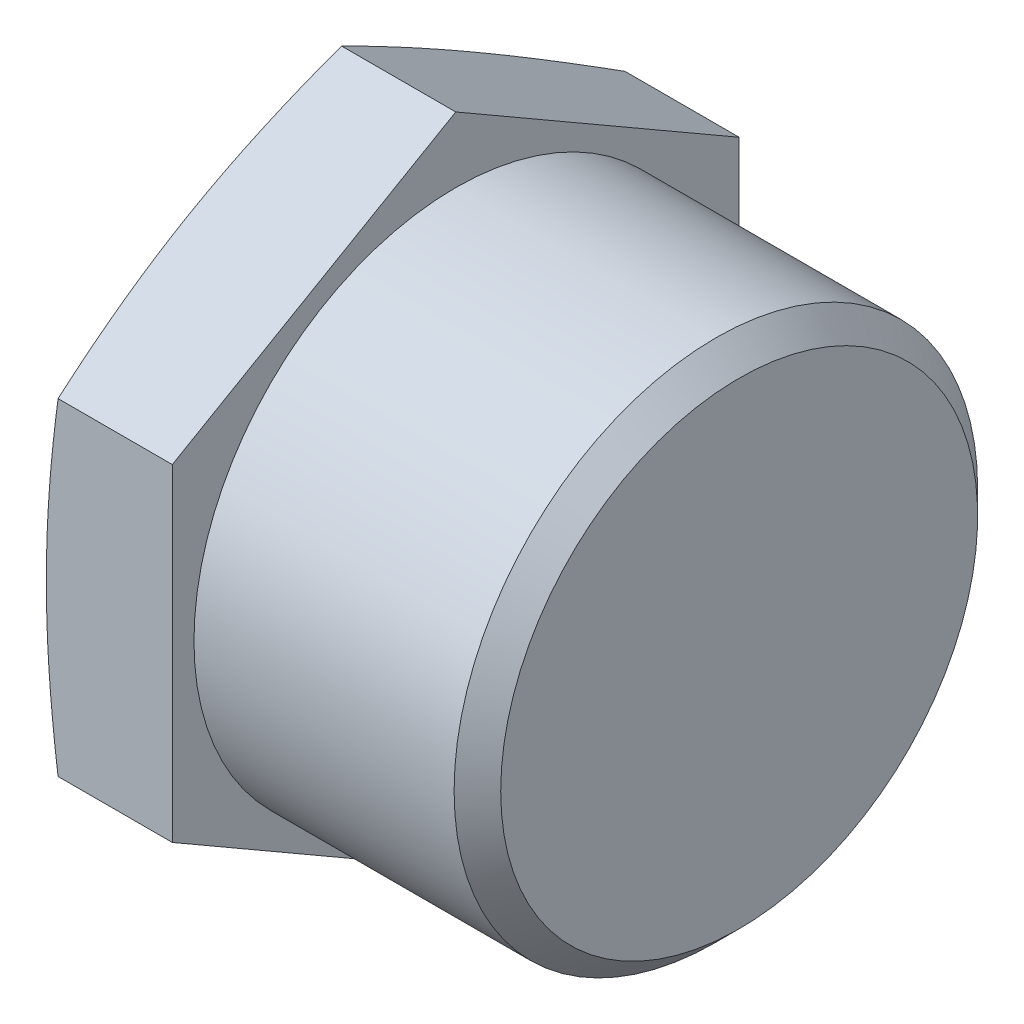
ISO-10303-21;
HEADER;
FILE_DESCRIPTION(('STEP AP214'),'2;1');
FILE_NAME('part.step','',(''),(''),'','','');
FILE_SCHEMA(('AUTOMOTIVE_DESIGN { 1 0 10303 214 1 1 1 1 }'));
ENDSEC;
DATA;
#1=APPLICATION_CONTEXT('core data for automotive mechanical design processes');
#2=APPLICATION_PROTOCOL_DEFINITION('international standard','automotive_design',2000,#1);
#3=PRODUCT_CONTEXT('',#1,'mechanical');
#4=PRODUCT('Part','Part','',(#3));
#5=PRODUCT_RELATED_PRODUCT_CATEGORY('part','',(#4));
#6=PRODUCT_DEFINITION_FORMATION('','',#4);
#7=PRODUCT_DEFINITION_CONTEXT('part definition',#1,'design');
#8=PRODUCT_DEFINITION('design','',#6,#7);
#9=PRODUCT_DEFINITION_SHAPE('','',#8);
#10=(LENGTH_UNIT() NAMED_UNIT(*) SI_UNIT(.MILLI.,.METRE.));
#11=(NAMED_UNIT(*) PLANE_ANGLE_UNIT() SI_UNIT($,.RADIAN.));
#12=(NAMED_UNIT(*) SI_UNIT($,.STERADIAN.) SOLID_ANGLE_UNIT());
#13=UNCERTAINTY_MEASURE_WITH_UNIT(LENGTH_MEASURE(1.E-05),#10,'distance_accuracy_value','');
#14=(GEOMETRIC_REPRESENTATION_CONTEXT(3) GLOBAL_UNCERTAINTY_ASSIGNED_CONTEXT((#13)) GLOBAL_UNIT_ASSIGNED_CONTEXT((#10,
#11,#12)) REPRESENTATION_CONTEXT('',''));
#15=CARTESIAN_POINT('',(0.,0.,0.));
#16=DIRECTION('',(0.,0.,1.));
#17=DIRECTION('',(1.,0.,0.));
#18=AXIS2_PLACEMENT_3D('',#15,#16,#17);
#19=CARTESIAN_POINT('',(18.,7.5725,0.));
#20=DIRECTION('',(1.,0.,0.));
#21=DIRECTION('',(0.,0.,-1.));
#22=AXIS2_PLACEMENT_3D('',#19,#20,#21);
#23=PLANE('',#22);
#24=CARTESIAN_POINT('',(18.,0.,0.));
#25=DIRECTION('',(-1.,0.,0.));
#26=DIRECTION('',(0.,0.,1.));
#27=AXIS2_PLACEMENT_3D('',#24,#25,#26);
#28=CIRCLE('',#27,15.145);
#29=CARTESIAN_POINT('',(18.,0.,15.145));
#30=VERTEX_POINT('',#29);
#31=EDGE_CURVE('E22',#30,#30,#28,.T.);
#32=ORIENTED_EDGE('',*,*,#31,.F.);
#33=EDGE_LOOP('',(#32));
#34=FACE_BOUND('',#33,.T.);
#35=ADVANCED_FACE('F17',(#34),#23,.T.);
#36=CARTESIAN_POINT('',(16.52,0.,0.));
#37=DIRECTION('',(-1.,0.,0.));
#38=DIRECTION('',(0.,0.,1.));
#39=AXIS2_PLACEMENT_3D('',#36,#37,#38);
#40=CONICAL_SURFACE('',#39,16.625,0.785398163397446);
#41=ORIENTED_EDGE('',*,*,#31,.T.);
#42=EDGE_LOOP('',(#41));
#43=FACE_BOUND('',#42,.T.);
#44=CARTESIAN_POINT('',(16.52,0.,0.));
#45=DIRECTION('',(-1.,0.,0.));
#46=DIRECTION('',(0.,0.,1.));
#47=AXIS2_PLACEMENT_3D('',#44,#45,#46);
#48=CIRCLE('',#47,16.625);
#49=CARTESIAN_POINT('',(16.52,0.,16.625));
#50=VERTEX_POINT('',#49);
#51=EDGE_CURVE('E262',#50,#50,#48,.T.);
#52=ORIENTED_EDGE('',*,*,#51,.F.);
#53=EDGE_LOOP('',(#52));
#54=FACE_BOUND('',#53,.T.);
#55=ADVANCED_FACE('F270',(#43,#54),#40,.T.);
#56=CARTESIAN_POINT('',(8.26,0.,0.));
#57=DIRECTION('',(-1.,0.,0.));
#58=DIRECTION('',(0.,0.,1.));
#59=AXIS2_PLACEMENT_3D('',#56,#57,#58);
#60=CYLINDRICAL_SURFACE('',#59,16.625);
#61=ORIENTED_EDGE('',*,*,#51,.T.);
#62=EDGE_LOOP('',(#61));
#63=FACE_BOUND('',#62,.T.);
#64=CARTESIAN_POINT('',(0.,0.,0.));
#65=DIRECTION('',(-1.,0.,0.));
#66=DIRECTION('',(0.,0.,1.));
#67=AXIS2_PLACEMENT_3D('',#64,#65,#66);
#68=CIRCLE('',#67,16.625);
#69=CARTESIAN_POINT('',(0.,0.,16.625));
#70=VERTEX_POINT('',#69);
#71=EDGE_CURVE('E244',#70,#70,#68,.T.);
#72=ORIENTED_EDGE('',*,*,#71,.F.);
#73=EDGE_LOOP('',(#72));
#74=FACE_BOUND('',#73,.T.);
#75=ADVANCED_FACE('F278',(#63,#74),#60,.T.);
#76=CARTESIAN_POINT('',(0.,19.1125,0.));
#77=DIRECTION('',(1.,0.,0.));
#78=DIRECTION('',(0.,0.,-1.));
#79=AXIS2_PLACEMENT_3D('',#76,#77,#78);
#80=PLANE('',#79);
#81=DIRECTION('',(0.,0.5,-0.866025403784439));
#82=VECTOR('',#81,1.);
#83=CARTESIAN_POINT('',(0.,-10.3923048454133,-18.));
#84=LINE('',#83,#82);
#85=CARTESIAN_POINT('',(0.,-10.3923048454133,-18.));
#86=VERTEX_POINT('',#85);
#87=CARTESIAN_POINT('',(0.,-20.7846096908265,0.));
#88=VERTEX_POINT('',#87);
#89=EDGE_CURVE('E231',#86,#88,#84,.F.);
#90=ORIENTED_EDGE('',*,*,#89,.F.);
#91=DIRECTION('',(0.,1.,0.));
#92=VECTOR('',#91,1.);
#93=CARTESIAN_POINT('',(0.,10.3923048454133,-18.));
#94=LINE('',#93,#92);
#95=CARTESIAN_POINT('',(0.,10.3923048454133,-18.));
#96=VERTEX_POINT('',#95);
#97=EDGE_CURVE('E236',#96,#86,#94,.F.);
#98=ORIENTED_EDGE('',*,*,#97,.F.);
#99=DIRECTION('',(0.,0.5,0.866025403784439));
#100=VECTOR('',#99,1.);
#101=CARTESIAN_POINT('',(0.,20.7846096908265,0.));
#102=LINE('',#101,#100);
#103=CARTESIAN_POINT('',(0.,20.7846096908265,0.));
#104=VERTEX_POINT('',#103);
#105=EDGE_CURVE('E240',#104,#96,#102,.F.);
#106=ORIENTED_EDGE('',*,*,#105,.F.);
#107=DIRECTION('',(0.,-0.5,0.866025403784439));
#108=VECTOR('',#107,1.);
#109=CARTESIAN_POINT('',(0.,10.3923048454133,18.));
#110=LINE('',#109,#108);
#111=CARTESIAN_POINT('',(0.,10.3923048454133,18.));
#112=VERTEX_POINT('',#111);
#113=EDGE_CURVE('E83',#112,#104,#110,.F.);
#114=ORIENTED_EDGE('',*,*,#113,.F.);
#115=DIRECTION('',(0.,1.,0.));
#116=VECTOR('',#115,1.);
#117=CARTESIAN_POINT('',(0.,-10.3923048454133,18.));
#118=LINE('',#117,#116);
#119=CARTESIAN_POINT('',(0.,-10.3923048454133,18.));
#120=VERTEX_POINT('',#119);
#121=EDGE_CURVE('E80',#120,#112,#118,.T.);
#122=ORIENTED_EDGE('',*,*,#121,.F.);
#123=DIRECTION('',(0.,-0.5,-0.866025403784439));
#124=VECTOR('',#123,1.);
#125=CARTESIAN_POINT('',(0.,-20.7846096908265,0.));
#126=LINE('',#125,#124);
#127=EDGE_CURVE('E221',#88,#120,#126,.F.);
#128=ORIENTED_EDGE('',*,*,#127,.F.);
#129=EDGE_LOOP('',(#90,#98,#106,#114,#122,#128));
#130=FACE_BOUND('',#129,.T.);
#131=ORIENTED_EDGE('',*,*,#71,.T.);
#132=EDGE_LOOP('',(#131));
#133=FACE_BOUND('',#132,.T.);
#134=ADVANCED_FACE('F300',(#130,#133),#80,.T.);
#135=CARTESIAN_POINT('',(0.,20.7846096908265,0.));
#136=DIRECTION('',(0.,0.866025403784439,-0.5));
#137=DIRECTION('',(0.,0.5,0.866025403784439));
#138=AXIS2_PLACEMENT_3D('',#135,#136,#137);
#139=PLANE('',#138);
#140=ORIENTED_EDGE('',*,*,#105,.T.);
#141=DIRECTION('',(-1.,0.,0.));
#142=VECTOR('',#141,1.);
#143=CARTESIAN_POINT('',(0.,10.3923048454133,-18.));
#144=LINE('',#143,#142);
#145=CARTESIAN_POINT('',(-7.25386608210715,10.3923048454133,-18.));
#146=VERTEX_POINT('',#145);
#147=EDGE_CURVE('E191',#146,#96,#144,.F.);
#148=ORIENTED_EDGE('',*,*,#147,.F.);
#149=CARTESIAN_POINT('',(-8.,15.5884572681199,-8.99999999999999));
#150=CARTESIAN_POINT('',(-8.00002482437553,15.3710725156564,-9.37652143605752));
#151=CARTESIAN_POINT('',(-7.99577981009083,15.1536897178002,-9.75303948663593));
#152=CARTESIAN_POINT('',(-7.97893256054131,14.7190118074851,-10.5059237122296));
#153=CARTESIAN_POINT('',(-7.96633059415192,14.5017166924301,-10.8822898917414));
#154=CARTESIAN_POINT('',(-7.93297069149941,14.0675288297443,-11.6343253299429));
#155=CARTESIAN_POINT('',(-7.91222196680328,13.8506359046787,-12.0099948959587));
#156=CARTESIAN_POINT('',(-7.8629120091088,13.4170747948359,-12.7609447663924));
#157=CARTESIAN_POINT('',(-7.83435074859285,13.200406610853,-13.1362250694345));
#158=CARTESIAN_POINT('',(-7.73758784542948,12.5509248872903,-14.2611604132325));
#159=CARTESIAN_POINT('',(-7.6582973719386,12.1185135098874,-15.0101188886652));
#160=CARTESIAN_POINT('',(-7.52022221809565,11.470698402133,-16.1321675692064));
#161=CARTESIAN_POINT('',(-7.47097212498671,11.2547650003805,-16.5061751920929));
#162=CARTESIAN_POINT('',(-7.36664904377479,10.8232645638328,-17.2535558716817));
#163=CARTESIAN_POINT('',(-7.31157645593415,10.6076975048875,-17.6269289702132));
#164=CARTESIAN_POINT('',(-7.25386608210716,10.3923048454133,-18.));
#165=B_SPLINE_CURVE_WITH_KNOTS('',3,(#149,#150,#151,#152,#153,#154,#155,#156,#157,#158,#159,
#160,#161,#162,#163,#164),.UNSPECIFIED.,.F.,.F.,(4,2,2,2,2,2,2,4),(0.,1.30428129122698,
2.60852062072218,3.91128946967326,5.21406290734101,7.81888559085143,9.12285504601664,
10.4267349191482),.UNSPECIFIED.);
#166=CARTESIAN_POINT('',(-8.,15.5884572681199,-8.99999999999999));
#167=VERTEX_POINT('',#166);
#168=EDGE_CURVE('E185',#167,#146,#165,.T.);
#169=ORIENTED_EDGE('',*,*,#168,.F.);
#170=CARTESIAN_POINT('',(-7.25386608210716,20.7846096908265,0.));
#171=CARTESIAN_POINT('',(-7.31157645593415,20.5692170313522,-0.373071029786788));
#172=CARTESIAN_POINT('',(-7.36664904377479,20.3536499724069,-0.746444128318249));
#173=CARTESIAN_POINT('',(-7.47097212498671,19.9221495358592,-1.49382480790704));
#174=CARTESIAN_POINT('',(-7.52022221809565,19.7062161341067,-1.86783243079357));
#175=CARTESIAN_POINT('',(-7.6582973719386,19.0584010263524,-2.98988111133478));
#176=CARTESIAN_POINT('',(-7.73758784542948,18.6259896489495,-3.73883958676746));
#177=CARTESIAN_POINT('',(-7.83435074859285,17.9765079253868,-4.86377493056545));
#178=CARTESIAN_POINT('',(-7.86291200910879,17.7598397414039,-5.23905523360755));
#179=CARTESIAN_POINT('',(-7.91222196680328,17.3262786315611,-5.99000510404123));
#180=CARTESIAN_POINT('',(-7.93297069149941,17.1093857064955,-6.36567467005707));
#181=CARTESIAN_POINT('',(-7.96633059415192,16.6751978438097,-7.11771010825858));
#182=CARTESIAN_POINT('',(-7.97893256054131,16.4579027287547,-7.49407628777034));
#183=CARTESIAN_POINT('',(-7.99577981009083,16.0232248184396,-8.24696051336405));
#184=CARTESIAN_POINT('',(-8.00002482437553,15.8058420205834,-8.62347856394246));
#185=CARTESIAN_POINT('',(-8.,15.5884572681199,-8.99999999999999));
#186=B_SPLINE_CURVE_WITH_KNOTS('',3,(#170,#171,#172,#173,#174,#175,#176,#177,#178,#179,#180,
#181,#182,#183,#184,#185),.UNSPECIFIED.,.F.,.F.,(4,2,2,2,2,2,2,4),(0.,1.30387987313161,
2.60784932829681,5.21267201180723,6.51544544947499,7.81821429842607,9.12245362792128,
10.4267349191483),.UNSPECIFIED.);
#187=CARTESIAN_POINT('',(-7.25386608210716,20.7846096908265,0.));
#188=VERTEX_POINT('',#187);
#189=EDGE_CURVE('E189',#188,#167,#186,.T.);
#190=ORIENTED_EDGE('',*,*,#189,.F.);
#191=DIRECTION('',(1.,0.,0.));
#192=VECTOR('',#191,1.);
#193=CARTESIAN_POINT('',(0.,20.7846096908265,0.));
#194=LINE('',#193,#192);
#195=EDGE_CURVE('E248',#104,#188,#194,.F.);
#196=ORIENTED_EDGE('',*,*,#195,.F.);
#197=EDGE_LOOP('',(#140,#148,#169,#190,#196));
#198=FACE_BOUND('',#197,.T.);
#199=ADVANCED_FACE('F187',(#198),#139,.T.);
#200=CARTESIAN_POINT('',(0.,10.3923048454133,-18.));
#201=DIRECTION('',(0.,0.,-1.));
#202=DIRECTION('',(-1.,0.,0.));
#203=AXIS2_PLACEMENT_3D('',#200,#201,#202);
#204=PLANE('',#203);
#205=ORIENTED_EDGE('',*,*,#97,.T.);
#206=DIRECTION('',(1.,0.,0.));
#207=VECTOR('',#206,1.);
#208=CARTESIAN_POINT('',(0.,-10.3923048454133,-18.));
#209=LINE('',#208,#207);
#210=CARTESIAN_POINT('',(-7.25386608210715,-10.3923048454133,-18.));
#211=VERTEX_POINT('',#210);
#212=EDGE_CURVE('E234',#211,#86,#209,.T.);
#213=ORIENTED_EDGE('',*,*,#212,.F.);
#214=CARTESIAN_POINT('',(-7.99999999999999,0.,-18.));
#215=CARTESIAN_POINT('',(-8.00002482437552,-0.434769504926965,-18.));
#216=CARTESIAN_POINT('',(-7.99577981009083,-0.869535100639358,-18.));
#217=CARTESIAN_POINT('',(-7.97893256054131,-1.73889092126966,-18.));
#218=CARTESIAN_POINT('',(-7.96633059415192,-2.17348115137964,-18.));
#219=CARTESIAN_POINT('',(-7.9329706914994,-3.0418568767512,-18.));
#220=CARTESIAN_POINT('',(-7.91222196680328,-3.47564272688239,-18.));
#221=CARTESIAN_POINT('',(-7.86291200910879,-4.342764946568,-18.));
#222=CARTESIAN_POINT('',(-7.83435074859284,-4.77610131453383,-18.));
#223=CARTESIAN_POINT('',(-7.73758784542947,-6.07506476165923,-18.));
#224=CARTESIAN_POINT('',(-7.65829737193859,-6.93988751646505,-18.));
#225=CARTESIAN_POINT('',(-7.52022221809564,-8.23551773197372,-18.));
#226=CARTESIAN_POINT('',(-7.4709721249867,-8.66738453547874,-18.));
#227=CARTESIAN_POINT('',(-7.36664904377478,-9.53038540857417,-18.));
#228=CARTESIAN_POINT('',(-7.31157645593413,-9.96151952646478,-18.));
#229=CARTESIAN_POINT('',(-7.25386608210715,-10.3923048454133,-18.));
#230=B_SPLINE_CURVE_WITH_KNOTS('',3,(#214,#215,#216,#217,#218,#219,#220,#221,#222,#223,#224,
#225,#226,#227,#228,#229),.UNSPECIFIED.,.F.,.F.,(4,2,2,2,2,2,2,4),(0.,1.30428129122698,
2.6085206207222,3.91128946967328,5.21406290734104,7.81888559085147,9.12285504601668,
10.4267349191483),.UNSPECIFIED.);
#231=CARTESIAN_POINT('',(-8.,0.,-18.));
#232=VERTEX_POINT('',#231);
#233=EDGE_CURVE('E207',#232,#211,#230,.T.);
#234=ORIENTED_EDGE('',*,*,#233,.F.);
#235=CARTESIAN_POINT('',(-7.25386608210715,10.3923048454133,-18.));
#236=CARTESIAN_POINT('',(-7.31157645593413,9.96151952646477,-18.));
#237=CARTESIAN_POINT('',(-7.36664904377478,9.53038540857416,-18.));
#238=CARTESIAN_POINT('',(-7.4709721249867,8.66738453547873,-18.));
#239=CARTESIAN_POINT('',(-7.52022221809564,8.23551773197371,-18.));
#240=CARTESIAN_POINT('',(-7.65829737193859,6.93988751646504,-18.));
#241=CARTESIAN_POINT('',(-7.73758784542947,6.07506476165923,-18.));
#242=CARTESIAN_POINT('',(-7.83435074859284,4.77610131453383,-18.));
#243=CARTESIAN_POINT('',(-7.86291200910879,4.342764946568,-18.));
#244=CARTESIAN_POINT('',(-7.91222196680328,3.47564272688239,-18.));
#245=CARTESIAN_POINT('',(-7.9329706914994,3.0418568767512,-18.));
#246=CARTESIAN_POINT('',(-7.96633059415192,2.17348115137964,-18.));
#247=CARTESIAN_POINT('',(-7.97893256054131,1.73889092126966,-18.));
#248=CARTESIAN_POINT('',(-7.99577981009082,0.869535100639356,-18.));
#249=CARTESIAN_POINT('',(-8.00002482437552,0.434769504926964,-18.));
#250=CARTESIAN_POINT('',(-7.99999999999999,0.,-18.));
#251=B_SPLINE_CURVE_WITH_KNOTS('',3,(#235,#236,#237,#238,#239,#240,#241,#242,#243,#244,#245,
#246,#247,#248,#249,#250),.UNSPECIFIED.,.F.,.F.,(4,2,2,2,2,2,2,4),(0.,1.30387987313161,
2.60784932829682,5.21267201180725,6.515445449475,7.81821429842609,9.1224536279213,
10.4267349191483),.UNSPECIFIED.);
#252=EDGE_CURVE('E196',#146,#232,#251,.T.);
#253=ORIENTED_EDGE('',*,*,#252,.F.);
#254=ORIENTED_EDGE('',*,*,#147,.T.);
#255=EDGE_LOOP('',(#205,#213,#234,#253,#254));
#256=FACE_BOUND('',#255,.T.);
#257=ADVANCED_FACE('F299',(#256),#204,.T.);
#258=CARTESIAN_POINT('',(0.,-10.3923048454133,-18.));
#259=DIRECTION('',(0.,-0.866025403784439,-0.5));
#260=DIRECTION('',(0.,0.5,-0.866025403784439));
#261=AXIS2_PLACEMENT_3D('',#258,#259,#260);
#262=PLANE('',#261);
#263=ORIENTED_EDGE('',*,*,#89,.T.);
#264=DIRECTION('',(1.,0.,0.));
#265=VECTOR('',#264,1.);
#266=CARTESIAN_POINT('',(0.,-20.7846096908265,0.));
#267=LINE('',#266,#265);
#268=CARTESIAN_POINT('',(-7.25386608210716,-20.7846096908265,0.));
#269=VERTEX_POINT('',#268);
#270=EDGE_CURVE('E217',#269,#88,#267,.T.);
#271=ORIENTED_EDGE('',*,*,#270,.F.);
#272=CARTESIAN_POINT('',(-7.99999999999999,-15.5884572681199,-9.00000000000002));
#273=CARTESIAN_POINT('',(-8.00002482437552,-15.8058420205834,-8.62347856394248));
#274=CARTESIAN_POINT('',(-7.99577981009082,-16.0232248184396,-8.24696051336408));
#275=CARTESIAN_POINT('',(-7.9789325605413,-16.4579027287547,-7.49407628777038));
#276=CARTESIAN_POINT('',(-7.96633059415191,-16.6751978438097,-7.11771010825861));
#277=CARTESIAN_POINT('',(-7.9329706914994,-17.1093857064955,-6.3656746700571));
#278=CARTESIAN_POINT('',(-7.91222196680327,-17.3262786315611,-5.99000510404126));
#279=CARTESIAN_POINT('',(-7.86291200910878,-17.7598397414039,-5.23905523360758));
#280=CARTESIAN_POINT('',(-7.83435074859283,-17.9765079253868,-4.86377493056548));
#281=CARTESIAN_POINT('',(-7.73758784542947,-18.6259896489495,-3.73883958676749));
#282=CARTESIAN_POINT('',(-7.65829737193859,-19.0584010263524,-2.98988111133482));
#283=CARTESIAN_POINT('',(-7.52022221809564,-19.7062161341068,-1.86783243079361));
#284=CARTESIAN_POINT('',(-7.4709721249867,-19.9221495358593,-1.49382480790708));
#285=CARTESIAN_POINT('',(-7.36664904377477,-20.353649972407,-0.746444128318288));
#286=CARTESIAN_POINT('',(-7.31157645593413,-20.5692170313523,-0.373071029786828));
#287=CARTESIAN_POINT('',(-7.25386608210715,-20.7846096908265,0.));
#288=B_SPLINE_CURVE_WITH_KNOTS('',3,(#272,#273,#274,#275,#276,#277,#278,#279,#280,#281,#282,
#283,#284,#285,#286,#287),.UNSPECIFIED.,.F.,.F.,(4,2,2,2,2,2,2,4),(0.,1.30428129122698,
2.60852062072218,3.91128946967327,5.21406290734101,7.81888559085143,9.12285504601664,
10.4267349191482),.UNSPECIFIED.);
#289=CARTESIAN_POINT('',(-7.99999999999999,-15.5884572681199,-9.00000000000001));
#290=VERTEX_POINT('',#289);
#291=EDGE_CURVE('E136',#290,#269,#288,.T.);
#292=ORIENTED_EDGE('',*,*,#291,.F.);
#293=CARTESIAN_POINT('',(-7.25386608210715,-10.3923048454133,-18.));
#294=CARTESIAN_POINT('',(-7.31157645593413,-10.6076975048876,-17.6269289702132));
#295=CARTESIAN_POINT('',(-7.36664904377477,-10.8232645638329,-17.2535558716817));
#296=CARTESIAN_POINT('',(-7.4709721249867,-11.2547650003806,-16.506175192093));
#297=CARTESIAN_POINT('',(-7.52022221809564,-11.4706984021331,-16.1321675692064));
#298=CARTESIAN_POINT('',(-7.65829737193859,-12.1185135098874,-15.0101188886652));
#299=CARTESIAN_POINT('',(-7.73758784542947,-12.5509248872903,-14.2611604132325));
#300=CARTESIAN_POINT('',(-7.83435074859283,-13.200406610853,-13.1362250694346));
#301=CARTESIAN_POINT('',(-7.86291200910878,-13.4170747948359,-12.7609447663925));
#302=CARTESIAN_POINT('',(-7.91222196680327,-13.8506359046787,-12.0099948959588));
#303=CARTESIAN_POINT('',(-7.9329706914994,-14.0675288297443,-11.6343253299429));
#304=CARTESIAN_POINT('',(-7.96633059415191,-14.5017166924301,-10.8822898917414));
#305=CARTESIAN_POINT('',(-7.9789325605413,-14.7190118074851,-10.5059237122297));
#306=CARTESIAN_POINT('',(-7.99577981009082,-15.1536897178002,-9.75303948663596));
#307=CARTESIAN_POINT('',(-8.00002482437552,-15.3710725156564,-9.37652143605755));
#308=CARTESIAN_POINT('',(-7.99999999999999,-15.5884572681199,-9.00000000000002));
#309=B_SPLINE_CURVE_WITH_KNOTS('',3,(#293,#294,#295,#296,#297,#298,#299,#300,#301,#302,#303,
#304,#305,#306,#307,#308),.UNSPECIFIED.,.F.,.F.,(4,2,2,2,2,2,2,4),(0.,1.3038798731316,
2.6078493282968,5.21267201180722,6.51544544947497,7.81821429842605,9.12245362792126,
10.4267349191482),.UNSPECIFIED.);
#310=EDGE_CURVE('E195',#211,#290,#309,.T.);
#311=ORIENTED_EDGE('',*,*,#310,.F.);
#312=ORIENTED_EDGE('',*,*,#212,.T.);
#313=EDGE_LOOP('',(#263,#271,#292,#311,#312));
#314=FACE_BOUND('',#313,.T.);
#315=ADVANCED_FACE('F120',(#314),#262,.T.);
#316=CARTESIAN_POINT('',(0.,-20.7846096908265,0.));
#317=DIRECTION('',(0.,-0.866025403784439,0.5));
#318=DIRECTION('',(0.,-0.5,-0.866025403784439));
#319=AXIS2_PLACEMENT_3D('',#316,#317,#318);
#320=PLANE('',#319);
#321=DIRECTION('',(1.,0.,0.));
#322=VECTOR('',#321,1.);
#323=CARTESIAN_POINT('',(0.,-10.3923048454133,18.));
#324=LINE('',#323,#322);
#325=CARTESIAN_POINT('',(-7.25386608210715,-10.3923048454133,18.));
#326=VERTEX_POINT('',#325);
#327=EDGE_CURVE('E218',#326,#120,#324,.T.);
#328=ORIENTED_EDGE('',*,*,#327,.F.);
#329=CARTESIAN_POINT('',(-8.,-15.5884572681199,8.99999999999999));
#330=CARTESIAN_POINT('',(-8.00002482437553,-15.3710725156564,9.37652143605752));
#331=CARTESIAN_POINT('',(-7.99577981009083,-15.1536897178002,9.75303948663593));
#332=CARTESIAN_POINT('',(-7.97893256054131,-14.719011807485,10.5059237122296));
#333=CARTESIAN_POINT('',(-7.96633059415192,-14.5017166924301,10.8822898917414));
#334=CARTESIAN_POINT('',(-7.93297069149941,-14.0675288297443,11.6343253299429));
#335=CARTESIAN_POINT('',(-7.91222196680328,-13.8506359046787,12.0099948959587));
#336=CARTESIAN_POINT('',(-7.8629120091088,-13.4170747948359,12.7609447663924));
#337=CARTESIAN_POINT('',(-7.83435074859285,-13.200406610853,13.1362250694345));
#338=CARTESIAN_POINT('',(-7.73758784542948,-12.5509248872903,14.2611604132325));
#339=CARTESIAN_POINT('',(-7.6582973719386,-12.1185135098874,15.0101188886652));
#340=CARTESIAN_POINT('',(-7.52022221809565,-11.470698402133,16.1321675692064));
#341=CARTESIAN_POINT('',(-7.47097212498671,-11.2547650003805,16.5061751920929));
#342=CARTESIAN_POINT('',(-7.36664904377479,-10.8232645638328,17.2535558716817));
#343=CARTESIAN_POINT('',(-7.31157645593415,-10.6076975048875,17.6269289702132));
#344=CARTESIAN_POINT('',(-7.25386608210716,-10.3923048454133,18.));
#345=B_SPLINE_CURVE_WITH_KNOTS('',3,(#329,#330,#331,#332,#333,#334,#335,#336,#337,#338,#339,
#340,#341,#342,#343,#344),.UNSPECIFIED.,.F.,.F.,(4,2,2,2,2,2,2,4),(0.,1.30428129122698,
2.60852062072218,3.91128946967327,5.21406290734101,7.81888559085144,9.12285504601664,
10.4267349191482),.UNSPECIFIED.);
#346=CARTESIAN_POINT('',(-8.,-15.5884572681199,9.));
#347=VERTEX_POINT('',#346);
#348=EDGE_CURVE('E95',#347,#326,#345,.T.);
#349=ORIENTED_EDGE('',*,*,#348,.F.);
#350=CARTESIAN_POINT('',(-7.25386608210716,-20.7846096908265,0.));
#351=CARTESIAN_POINT('',(-7.31157645593414,-20.5692170313522,0.373071029786788));
#352=CARTESIAN_POINT('',(-7.36664904377478,-20.3536499724069,0.746444128318249));
#353=CARTESIAN_POINT('',(-7.47097212498671,-19.9221495358592,1.49382480790704));
#354=CARTESIAN_POINT('',(-7.52022221809565,-19.7062161341067,1.86783243079357));
#355=CARTESIAN_POINT('',(-7.6582973719386,-19.0584010263524,2.98988111133478));
#356=CARTESIAN_POINT('',(-7.73758784542948,-18.6259896489495,3.73883958676746));
#357=CARTESIAN_POINT('',(-7.83435074859285,-17.9765079253868,4.86377493056545));
#358=CARTESIAN_POINT('',(-7.8629120091088,-17.7598397414039,5.23905523360755));
#359=CARTESIAN_POINT('',(-7.91222196680328,-17.3262786315611,5.99000510404123));
#360=CARTESIAN_POINT('',(-7.93297069149941,-17.1093857064955,6.36567467005707));
#361=CARTESIAN_POINT('',(-7.96633059415192,-16.6751978438097,7.11771010825858));
#362=CARTESIAN_POINT('',(-7.97893256054131,-16.4579027287547,7.49407628777035));
#363=CARTESIAN_POINT('',(-7.99577981009083,-16.0232248184396,8.24696051336405));
#364=CARTESIAN_POINT('',(-8.00002482437553,-15.8058420205834,8.62347856394246));
#365=CARTESIAN_POINT('',(-8.,-15.5884572681199,8.99999999999999));
#366=B_SPLINE_CURVE_WITH_KNOTS('',3,(#350,#351,#352,#353,#354,#355,#356,#357,#358,#359,#360,
#361,#362,#363,#364,#365),.UNSPECIFIED.,.F.,.F.,(4,2,2,2,2,2,2,4),(0.,1.30387987313161,
2.60784932829681,5.21267201180723,6.51544544947499,7.81821429842607,9.12245362792128,
10.4267349191483),.UNSPECIFIED.);
#367=EDGE_CURVE('E129',#269,#347,#366,.T.);
#368=ORIENTED_EDGE('',*,*,#367,.F.);
#369=ORIENTED_EDGE('',*,*,#270,.T.);
#370=ORIENTED_EDGE('',*,*,#127,.T.);
#371=EDGE_LOOP('',(#328,#349,#368,#369,#370));
#372=FACE_BOUND('',#371,.T.);
#373=ADVANCED_FACE('F113',(#372),#320,.T.);
#374=CARTESIAN_POINT('',(0.,-10.3923048454133,18.));
#375=DIRECTION('',(0.,0.,1.));
#376=DIRECTION('',(1.,0.,0.));
#377=AXIS2_PLACEMENT_3D('',#374,#375,#376);
#378=PLANE('',#377);
#379=DIRECTION('',(1.,0.,0.));
#380=VECTOR('',#379,1.);
#381=CARTESIAN_POINT('',(0.,10.3923048454133,18.));
#382=LINE('',#381,#380);
#383=CARTESIAN_POINT('',(-7.25386608210715,10.3923048454133,18.));
#384=VERTEX_POINT('',#383);
#385=EDGE_CURVE('E75',#384,#112,#382,.T.);
#386=ORIENTED_EDGE('',*,*,#385,.F.);
#387=CARTESIAN_POINT('',(-7.99999999999999,0.,18.));
#388=CARTESIAN_POINT('',(-8.00002482437552,0.434769504926964,18.));
#389=CARTESIAN_POINT('',(-7.99577981009082,0.869535100639357,18.));
#390=CARTESIAN_POINT('',(-7.9789325605413,1.73889092126966,18.));
#391=CARTESIAN_POINT('',(-7.96633059415191,2.17348115137964,18.));
#392=CARTESIAN_POINT('',(-7.9329706914994,3.0418568767512,18.));
#393=CARTESIAN_POINT('',(-7.91222196680327,3.47564272688239,18.));
#394=CARTESIAN_POINT('',(-7.86291200910878,4.342764946568,18.));
#395=CARTESIAN_POINT('',(-7.83435074859284,4.77610131453384,18.));
#396=CARTESIAN_POINT('',(-7.73758784542947,6.07506476165923,18.));
#397=CARTESIAN_POINT('',(-7.65829737193859,6.93988751646504,18.));
#398=CARTESIAN_POINT('',(-7.52022221809564,8.23551773197372,18.));
#399=CARTESIAN_POINT('',(-7.4709721249867,8.66738453547874,18.));
#400=CARTESIAN_POINT('',(-7.36664904377477,9.53038540857417,18.));
#401=CARTESIAN_POINT('',(-7.31157645593413,9.96151952646478,18.));
#402=CARTESIAN_POINT('',(-7.25386608210715,10.3923048454133,18.));
#403=B_SPLINE_CURVE_WITH_KNOTS('',3,(#387,#388,#389,#390,#391,#392,#393,#394,#395,#396,#397,
#398,#399,#400,#401,#402),.UNSPECIFIED.,.F.,.F.,(4,2,2,2,2,2,2,4),(0.,1.30428129122698,
2.6085206207222,3.91128946967328,5.21406290734104,7.81888559085147,9.12285504601668,
10.4267349191483),.UNSPECIFIED.);
#404=CARTESIAN_POINT('',(-7.99999999999999,0.,18.));
#405=VERTEX_POINT('',#404);
#406=EDGE_CURVE('E37',#405,#384,#403,.T.);
#407=ORIENTED_EDGE('',*,*,#406,.F.);
#408=CARTESIAN_POINT('',(-7.25386608210715,-10.3923048454133,18.));
#409=CARTESIAN_POINT('',(-7.31157645593413,-9.96151952646477,18.));
#410=CARTESIAN_POINT('',(-7.36664904377478,-9.53038540857416,18.));
#411=CARTESIAN_POINT('',(-7.4709721249867,-8.66738453547873,18.));
#412=CARTESIAN_POINT('',(-7.52022221809564,-8.23551773197371,18.));
#413=CARTESIAN_POINT('',(-7.65829737193859,-6.93988751646504,18.));
#414=CARTESIAN_POINT('',(-7.73758784542947,-6.07506476165923,18.));
#415=CARTESIAN_POINT('',(-7.83435074859284,-4.77610131453383,18.));
#416=CARTESIAN_POINT('',(-7.86291200910879,-4.342764946568,18.));
#417=CARTESIAN_POINT('',(-7.91222196680328,-3.47564272688239,18.));
#418=CARTESIAN_POINT('',(-7.9329706914994,-3.0418568767512,18.));
#419=CARTESIAN_POINT('',(-7.96633059415191,-2.17348115137964,18.));
#420=CARTESIAN_POINT('',(-7.9789325605413,-1.73889092126966,18.));
#421=CARTESIAN_POINT('',(-7.99577981009083,-0.869535100639357,18.));
#422=CARTESIAN_POINT('',(-8.00002482437552,-0.434769504926964,18.));
#423=CARTESIAN_POINT('',(-7.99999999999999,0.,18.));
#424=B_SPLINE_CURVE_WITH_KNOTS('',3,(#408,#409,#410,#411,#412,#413,#414,#415,#416,#417,#418,
#419,#420,#421,#422,#423),.UNSPECIFIED.,.F.,.F.,(4,2,2,2,2,2,2,4),(0.,1.30387987313161,
2.60784932829682,5.21267201180725,6.515445449475,7.81821429842608,9.1224536279213,
10.4267349191483),.UNSPECIFIED.);
#425=EDGE_CURVE('E93',#326,#405,#424,.T.);
#426=ORIENTED_EDGE('',*,*,#425,.F.);
#427=ORIENTED_EDGE('',*,*,#327,.T.);
#428=ORIENTED_EDGE('',*,*,#121,.T.);
#429=EDGE_LOOP('',(#386,#407,#426,#427,#428));
#430=FACE_BOUND('',#429,.T.);
#431=ADVANCED_FACE('F76',(#430),#378,.T.);
#432=CARTESIAN_POINT('',(0.,10.3923048454133,18.));
#433=DIRECTION('',(0.,0.866025403784439,0.5));
#434=DIRECTION('',(0.,-0.5,0.866025403784439));
#435=AXIS2_PLACEMENT_3D('',#432,#433,#434);
#436=PLANE('',#435);
#437=ORIENTED_EDGE('',*,*,#195,.T.);
#438=CARTESIAN_POINT('',(-7.99999999999999,15.5884572681199,9.00000000000002));
#439=CARTESIAN_POINT('',(-8.00002482437552,15.8058420205834,8.62347856394248));
#440=CARTESIAN_POINT('',(-7.99577981009082,16.0232248184396,8.24696051336408));
#441=CARTESIAN_POINT('',(-7.9789325605413,16.4579027287547,7.49407628777037));
#442=CARTESIAN_POINT('',(-7.96633059415191,16.6751978438097,7.11771010825861));
#443=CARTESIAN_POINT('',(-7.9329706914994,17.1093857064955,6.3656746700571));
#444=CARTESIAN_POINT('',(-7.91222196680327,17.3262786315611,5.99000510404126));
#445=CARTESIAN_POINT('',(-7.86291200910878,17.7598397414039,5.23905523360757));
#446=CARTESIAN_POINT('',(-7.83435074859284,17.9765079253868,4.86377493056548));
#447=CARTESIAN_POINT('',(-7.73758784542947,18.6259896489495,3.73883958676749));
#448=CARTESIAN_POINT('',(-7.65829737193859,19.0584010263524,2.98988111133482));
#449=CARTESIAN_POINT('',(-7.52022221809564,19.7062161341068,1.86783243079361));
#450=CARTESIAN_POINT('',(-7.4709721249867,19.9221495358593,1.49382480790708));
#451=CARTESIAN_POINT('',(-7.36664904377477,20.353649972407,0.746444128318286));
#452=CARTESIAN_POINT('',(-7.31157645593413,20.5692170313523,0.373071029786826));
#453=CARTESIAN_POINT('',(-7.25386608210715,20.7846096908265,0.));
#454=B_SPLINE_CURVE_WITH_KNOTS('',3,(#438,#439,#440,#441,#442,#443,#444,#445,#446,#447,#448,
#449,#450,#451,#452,#453),.UNSPECIFIED.,.F.,.F.,(4,2,2,2,2,2,2,4),(0.,1.30428129122698,
2.60852062072219,3.91128946967327,5.21406290734102,7.81888559085143,9.12285504601664,
10.4267349191482),.UNSPECIFIED.);
#455=CARTESIAN_POINT('',(-8.,15.5884572681199,9.));
#456=VERTEX_POINT('',#455);
#457=EDGE_CURVE('E71',#456,#188,#454,.T.);
#458=ORIENTED_EDGE('',*,*,#457,.F.);
#459=CARTESIAN_POINT('',(-7.25386608210715,10.3923048454133,18.));
#460=CARTESIAN_POINT('',(-7.31157645593413,10.6076975048876,17.6269289702132));
#461=CARTESIAN_POINT('',(-7.36664904377477,10.8232645638329,17.2535558716818));
#462=CARTESIAN_POINT('',(-7.4709721249867,11.2547650003806,16.506175192093));
#463=CARTESIAN_POINT('',(-7.52022221809564,11.4706984021331,16.1321675692064));
#464=CARTESIAN_POINT('',(-7.65829737193859,12.1185135098874,15.0101188886652));
#465=CARTESIAN_POINT('',(-7.73758784542947,12.5509248872903,14.2611604132325));
#466=CARTESIAN_POINT('',(-7.83435074859283,13.200406610853,13.1362250694346));
#467=CARTESIAN_POINT('',(-7.86291200910878,13.4170747948359,12.7609447663925));
#468=CARTESIAN_POINT('',(-7.91222196680327,13.8506359046787,12.0099948959588));
#469=CARTESIAN_POINT('',(-7.9329706914994,14.0675288297443,11.6343253299429));
#470=CARTESIAN_POINT('',(-7.96633059415191,14.5017166924301,10.8822898917414));
#471=CARTESIAN_POINT('',(-7.9789325605413,14.7190118074851,10.5059237122297));
#472=CARTESIAN_POINT('',(-7.99577981009082,15.1536897178002,9.75303948663596));
#473=CARTESIAN_POINT('',(-8.00002482437551,15.3710725156564,9.37652143605755));
#474=CARTESIAN_POINT('',(-7.99999999999999,15.5884572681199,9.00000000000002));
#475=B_SPLINE_CURVE_WITH_KNOTS('',3,(#459,#460,#461,#462,#463,#464,#465,#466,#467,#468,#469,
#470,#471,#472,#473,#474),.UNSPECIFIED.,.F.,.F.,(4,2,2,2,2,2,2,4),(0.,1.3038798731316,
2.60784932829681,5.21267201180723,6.51544544947498,7.81821429842606,9.12245362792127,
10.4267349191482),.UNSPECIFIED.);
#476=EDGE_CURVE('E86',#384,#456,#475,.T.);
#477=ORIENTED_EDGE('',*,*,#476,.F.);
#478=ORIENTED_EDGE('',*,*,#385,.T.);
#479=ORIENTED_EDGE('',*,*,#113,.T.);
#480=EDGE_LOOP('',(#437,#458,#477,#478,#479));
#481=FACE_BOUND('',#480,.T.);
#482=ADVANCED_FACE('F87',(#481),#436,.T.);
#483=CARTESIAN_POINT('',(-7.24938927859981,0.,0.));
#484=DIRECTION('',(1.,0.,0.));
#485=DIRECTION('',(0.,0.,-1.));
#486=AXIS2_PLACEMENT_3D('',#483,#484,#485);
#487=CONICAL_SURFACE('',#486,20.8013173489715,1.30899693899575);
#488=ORIENTED_EDGE('',*,*,#189,.T.);
#489=CARTESIAN_POINT('',(-8.,0.,0.));
#490=DIRECTION('',(-1.,0.,0.));
#491=DIRECTION('',(0.,0.,1.));
#492=AXIS2_PLACEMENT_3D('',#489,#490,#491);
#493=CIRCLE('',#492,18.);
#494=EDGE_CURVE('E90',#456,#167,#493,.T.);
#495=ORIENTED_EDGE('',*,*,#494,.F.);
#496=ORIENTED_EDGE('',*,*,#457,.T.);
#497=EDGE_LOOP('',(#488,#495,#496));
#498=FACE_BOUND('',#497,.T.);
#499=ADVANCED_FACE('F198',(#498),#487,.T.);
#500=CARTESIAN_POINT('',(-7.2493892785998,0.,0.));
#501=DIRECTION('',(1.,0.,0.));
#502=DIRECTION('',(0.,0.,-1.));
#503=AXIS2_PLACEMENT_3D('',#500,#501,#502);
#504=CONICAL_SURFACE('',#503,20.8013173489715,1.30899693899575);
#505=CARTESIAN_POINT('',(-8.,0.,0.));
#506=DIRECTION('',(-1.,0.,0.));
#507=DIRECTION('',(0.,0.,1.));
#508=AXIS2_PLACEMENT_3D('',#505,#506,#507);
#509=CIRCLE('',#508,18.);
#510=EDGE_CURVE('E176',#167,#232,#509,.T.);
#511=ORIENTED_EDGE('',*,*,#510,.F.);
#512=ORIENTED_EDGE('',*,*,#168,.T.);
#513=ORIENTED_EDGE('',*,*,#252,.T.);
#514=EDGE_LOOP('',(#511,#512,#513));
#515=FACE_BOUND('',#514,.T.);
#516=ADVANCED_FACE('F200',(#515),#504,.T.);
#517=CARTESIAN_POINT('',(-7.2493892785998,0.,0.));
#518=DIRECTION('',(1.,0.,0.));
#519=DIRECTION('',(0.,0.,-1.));
#520=AXIS2_PLACEMENT_3D('',#517,#518,#519);
#521=CONICAL_SURFACE('',#520,20.8013173489716,1.30899693899575);
#522=CARTESIAN_POINT('',(-8.,0.,0.));
#523=DIRECTION('',(-1.,0.,0.));
#524=DIRECTION('',(0.,0.,1.));
#525=AXIS2_PLACEMENT_3D('',#522,#523,#524);
#526=CIRCLE('',#525,18.);
#527=EDGE_CURVE('E171',#232,#290,#526,.T.);
#528=ORIENTED_EDGE('',*,*,#527,.F.);
#529=ORIENTED_EDGE('',*,*,#233,.T.);
#530=ORIENTED_EDGE('',*,*,#310,.T.);
#531=EDGE_LOOP('',(#528,#529,#530));
#532=FACE_BOUND('',#531,.T.);
#533=ADVANCED_FACE('F146',(#532),#521,.T.);
#534=CARTESIAN_POINT('',(-7.24938927859982,0.,0.));
#535=DIRECTION('',(1.,0.,0.));
#536=DIRECTION('',(0.,1.,0.));
#537=AXIS2_PLACEMENT_3D('',#534,#535,#536);
#538=CONICAL_SURFACE('',#537,20.8013173489715,1.30899693899575);
#539=ORIENTED_EDGE('',*,*,#291,.T.);
#540=ORIENTED_EDGE('',*,*,#367,.T.);
#541=CARTESIAN_POINT('',(-8.,0.,0.));
#542=DIRECTION('',(-1.,0.,0.));
#543=DIRECTION('',(0.,0.,1.));
#544=AXIS2_PLACEMENT_3D('',#541,#542,#543);
#545=CIRCLE('',#544,18.0000000000001);
#546=EDGE_CURVE('E168',#290,#347,#545,.T.);
#547=ORIENTED_EDGE('',*,*,#546,.F.);
#548=EDGE_LOOP('',(#539,#540,#547));
#549=FACE_BOUND('',#548,.T.);
#550=ADVANCED_FACE('F141',(#549),#538,.T.);
#551=CARTESIAN_POINT('',(-7.2493892785998,0.,0.));
#552=DIRECTION('',(1.,0.,0.));
#553=DIRECTION('',(0.,0.,-1.));
#554=AXIS2_PLACEMENT_3D('',#551,#552,#553);
#555=CONICAL_SURFACE('',#554,20.8013173489715,1.30899693899575);
#556=ORIENTED_EDGE('',*,*,#425,.T.);
#557=CARTESIAN_POINT('',(-8.,0.,0.));
#558=DIRECTION('',(-1.,0.,0.));
#559=DIRECTION('',(0.,0.,1.));
#560=AXIS2_PLACEMENT_3D('',#557,#558,#559);
#561=CIRCLE('',#560,18.);
#562=EDGE_CURVE('E28',#347,#405,#561,.T.);
#563=ORIENTED_EDGE('',*,*,#562,.F.);
#564=ORIENTED_EDGE('',*,*,#348,.T.);
#565=EDGE_LOOP('',(#556,#563,#564));
#566=FACE_BOUND('',#565,.T.);
#567=ADVANCED_FACE('F145',(#566),#555,.T.);
#568=CARTESIAN_POINT('',(-7.24938927859979,0.,0.));
#569=DIRECTION('',(1.,0.,0.));
#570=DIRECTION('',(0.,0.,-1.));
#571=AXIS2_PLACEMENT_3D('',#568,#569,#570);
#572=CONICAL_SURFACE('',#571,20.8013173489715,1.30899693899575);
#573=ORIENTED_EDGE('',*,*,#476,.T.);
#574=CARTESIAN_POINT('',(-8.,0.,0.));
#575=DIRECTION('',(-1.,0.,0.));
#576=DIRECTION('',(0.,0.,1.));
#577=AXIS2_PLACEMENT_3D('',#574,#575,#576);
#578=CIRCLE('',#577,18.);
#579=EDGE_CURVE('E11',#405,#456,#578,.T.);
#580=ORIENTED_EDGE('',*,*,#579,.F.);
#581=ORIENTED_EDGE('',*,*,#406,.T.);
#582=EDGE_LOOP('',(#573,#580,#581));
#583=FACE_BOUND('',#582,.T.);
#584=ADVANCED_FACE('F19',(#583),#572,.T.);
#585=CARTESIAN_POINT('',(-8.,9.,0.));
#586=DIRECTION('',(-1.,0.,0.));
#587=DIRECTION('',(0.,0.,1.));
#588=AXIS2_PLACEMENT_3D('',#585,#586,#587);
#589=PLANE('',#588);
#590=ORIENTED_EDGE('',*,*,#562,.T.);
#591=ORIENTED_EDGE('',*,*,#579,.T.);
#592=ORIENTED_EDGE('',*,*,#494,.T.);
#593=ORIENTED_EDGE('',*,*,#510,.T.);
#594=ORIENTED_EDGE('',*,*,#527,.T.);
#595=ORIENTED_EDGE('',*,*,#546,.T.);
#596=EDGE_LOOP('',(#590,#591,#592,#593,#594,#595));
#597=FACE_BOUND('',#596,.T.);
#598=ADVANCED_FACE('F159',(#597),#589,.T.);
#599=CLOSED_SHELL('',(#35,#55,#75,#134,#199,#257,#315,#373,#431,#482,#499,#516,#533,#550,#567,
#584,#598));
#600=MANIFOLD_SOLID_BREP('B1',#599);
#601=ADVANCED_BREP_SHAPE_REPRESENTATION('',(#18,#600),#14);
#602=SHAPE_DEFINITION_REPRESENTATION(#9,#601);
ENDSEC;
END-ISO-10303-21;
